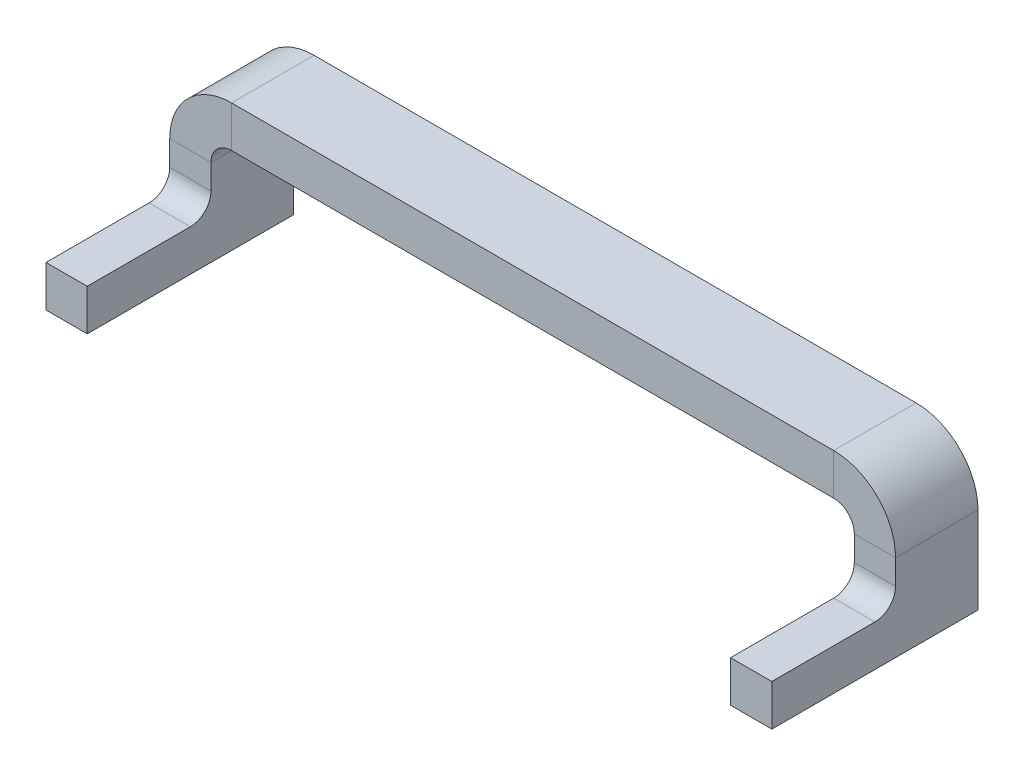
ISO-10303-21;
HEADER;
FILE_DESCRIPTION(('STEP AP214'),'2;1');
FILE_NAME('part.step','',(''),(''),'','','');
FILE_SCHEMA(('AUTOMOTIVE_DESIGN { 1 0 10303 214 1 1 1 1 }'));
ENDSEC;
DATA;
#1=APPLICATION_CONTEXT('core data for automotive mechanical design processes');
#2=APPLICATION_PROTOCOL_DEFINITION('international standard','automotive_design',2000,#1);
#3=PRODUCT_CONTEXT('',#1,'mechanical');
#4=PRODUCT('Part','Part','',(#3));
#5=PRODUCT_RELATED_PRODUCT_CATEGORY('part','',(#4));
#6=PRODUCT_DEFINITION_FORMATION('','',#4);
#7=PRODUCT_DEFINITION_CONTEXT('part definition',#1,'design');
#8=PRODUCT_DEFINITION('design','',#6,#7);
#9=PRODUCT_DEFINITION_SHAPE('','',#8);
#10=(LENGTH_UNIT() NAMED_UNIT(*) SI_UNIT(.MILLI.,.METRE.));
#11=(NAMED_UNIT(*) PLANE_ANGLE_UNIT() SI_UNIT($,.RADIAN.));
#12=(NAMED_UNIT(*) SI_UNIT($,.STERADIAN.) SOLID_ANGLE_UNIT());
#13=UNCERTAINTY_MEASURE_WITH_UNIT(LENGTH_MEASURE(1.E-05),#10,'distance_accuracy_value','');
#14=(GEOMETRIC_REPRESENTATION_CONTEXT(3) GLOBAL_UNCERTAINTY_ASSIGNED_CONTEXT((#13)) GLOBAL_UNIT_ASSIGNED_CONTEXT((#10,
#11,#12)) REPRESENTATION_CONTEXT('',''));
#15=CARTESIAN_POINT('',(0.,0.,0.));
#16=DIRECTION('',(0.,0.,1.));
#17=DIRECTION('',(1.,0.,0.));
#18=AXIS2_PLACEMENT_3D('',#15,#16,#17);
#19=CARTESIAN_POINT('',(88.0000000000001,-26.,20.));
#20=DIRECTION('',(0.,0.,1.));
#21=DIRECTION('',(0.,-1.,0.));
#22=AXIS2_PLACEMENT_3D('',#19,#20,#21);
#23=PLANE('',#22);
#24=DIRECTION('',(0.,1.,0.));
#25=VECTOR('',#24,1.);
#26=CARTESIAN_POINT('',(78.0000000000001,-26.,20.));
#27=LINE('',#26,#25);
#28=CARTESIAN_POINT('',(78.,-11.0000000000006,20.));
#29=VERTEX_POINT('',#28);
#30=CARTESIAN_POINT('',(78.,-4.99999999999998,20.));
#31=VERTEX_POINT('',#30);
#32=EDGE_CURVE('E239',#29,#31,#27,.T.);
#33=ORIENTED_EDGE('',*,*,#32,.F.);
#34=DIRECTION('',(1.,0.,0.));
#35=VECTOR('',#34,1.);
#36=CARTESIAN_POINT('',(88.0000000000001,-11.0000000000006,20.));
#37=LINE('',#36,#35);
#38=CARTESIAN_POINT('',(88.,-11.0000000000006,20.));
#39=VERTEX_POINT('',#38);
#40=EDGE_CURVE('E382',#29,#39,#37,.T.);
#41=ORIENTED_EDGE('',*,*,#40,.T.);
#42=DIRECTION('',(0.,1.,0.));
#43=VECTOR('',#42,1.);
#44=CARTESIAN_POINT('',(88.0000000000001,-26.,20.));
#45=LINE('',#44,#43);
#46=CARTESIAN_POINT('',(88.,-4.99999999999994,20.));
#47=VERTEX_POINT('',#46);
#48=EDGE_CURVE('E242',#39,#47,#45,.T.);
#49=ORIENTED_EDGE('',*,*,#48,.T.);
#50=DIRECTION('',(1.,0.,0.));
#51=VECTOR('',#50,1.);
#52=CARTESIAN_POINT('',(78.,-4.99999999999998,20.));
#53=LINE('',#52,#51);
#54=EDGE_CURVE('E224',#31,#47,#53,.T.);
#55=ORIENTED_EDGE('',*,*,#54,.F.);
#56=EDGE_LOOP('',(#33,#41,#49,#55));
#57=FACE_BOUND('',#56,.T.);
#58=ADVANCED_FACE('F43',(#57),#23,.T.);
#59=CARTESIAN_POINT('',(-88.0000000000001,-26.,20.));
#60=DIRECTION('',(0.,0.,1.));
#61=DIRECTION('',(0.,-1.,0.));
#62=AXIS2_PLACEMENT_3D('',#59,#60,#61);
#63=PLANE('',#62);
#64=DIRECTION('',(0.,-1.,0.));
#65=VECTOR('',#64,1.);
#66=CARTESIAN_POINT('',(-88.0000000000001,-26.,20.));
#67=LINE('',#66,#65);
#68=CARTESIAN_POINT('',(-88.,-4.99999999999994,20.));
#69=VERTEX_POINT('',#68);
#70=CARTESIAN_POINT('',(-88.,-11.,20.));
#71=VERTEX_POINT('',#70);
#72=EDGE_CURVE('E304',#69,#71,#67,.T.);
#73=ORIENTED_EDGE('',*,*,#72,.T.);
#74=DIRECTION('',(1.,0.,0.));
#75=VECTOR('',#74,1.);
#76=CARTESIAN_POINT('',(-88.,-11.,20.));
#77=LINE('',#76,#75);
#78=CARTESIAN_POINT('',(-78.,-11.,20.));
#79=VERTEX_POINT('',#78);
#80=EDGE_CURVE('E369',#71,#79,#77,.T.);
#81=ORIENTED_EDGE('',*,*,#80,.T.);
#82=DIRECTION('',(0.,-1.,0.));
#83=VECTOR('',#82,1.);
#84=CARTESIAN_POINT('',(-78.0000000000001,-26.,20.));
#85=LINE('',#84,#83);
#86=CARTESIAN_POINT('',(-78.,-4.99999999999998,20.));
#87=VERTEX_POINT('',#86);
#88=EDGE_CURVE('E303',#87,#79,#85,.T.);
#89=ORIENTED_EDGE('',*,*,#88,.F.);
#90=DIRECTION('',(-1.,0.,0.));
#91=VECTOR('',#90,1.);
#92=CARTESIAN_POINT('',(-78.,-4.99999999999998,20.));
#93=LINE('',#92,#91);
#94=EDGE_CURVE('E284',#87,#69,#93,.T.);
#95=ORIENTED_EDGE('',*,*,#94,.T.);
#96=EDGE_LOOP('',(#73,#81,#89,#95));
#97=FACE_BOUND('',#96,.T.);
#98=ADVANCED_FACE('F403',(#97),#63,.T.);
#99=CARTESIAN_POINT('',(-78.,10.,20.));
#100=DIRECTION('',(0.,0.,-1.));
#101=DIRECTION('',(-1.,0.,0.));
#102=AXIS2_PLACEMENT_3D('',#99,#100,#101);
#103=PLANE('',#102);
#104=DIRECTION('',(0.,1.,0.));
#105=VECTOR('',#104,1.);
#106=CARTESIAN_POINT('',(73.,0.,20.));
#107=LINE('',#106,#105);
#108=CARTESIAN_POINT('',(73.,0.,20.));
#109=VERTEX_POINT('',#108);
#110=CARTESIAN_POINT('',(73.,10.,20.));
#111=VERTEX_POINT('',#110);
#112=EDGE_CURVE('E266',#109,#111,#107,.T.);
#113=ORIENTED_EDGE('',*,*,#112,.T.);
#114=DIRECTION('',(1.,0.,0.));
#115=VECTOR('',#114,1.);
#116=CARTESIAN_POINT('',(-78.,10.,20.));
#117=LINE('',#116,#115);
#118=CARTESIAN_POINT('',(-73.,10.,20.));
#119=VERTEX_POINT('',#118);
#120=EDGE_CURVE('E360',#119,#111,#117,.T.);
#121=ORIENTED_EDGE('',*,*,#120,.F.);
#122=DIRECTION('',(0.,1.,0.));
#123=VECTOR('',#122,1.);
#124=CARTESIAN_POINT('',(-73.,0.,20.));
#125=LINE('',#124,#123);
#126=CARTESIAN_POINT('',(-73.,0.,20.));
#127=VERTEX_POINT('',#126);
#128=EDGE_CURVE('E352',#127,#119,#125,.T.);
#129=ORIENTED_EDGE('',*,*,#128,.F.);
#130=DIRECTION('',(1.,0.,0.));
#131=VECTOR('',#130,1.);
#132=CARTESIAN_POINT('',(-78.,0.,20.));
#133=LINE('',#132,#131);
#134=EDGE_CURVE('E356',#127,#109,#133,.T.);
#135=ORIENTED_EDGE('',*,*,#134,.T.);
#136=EDGE_LOOP('',(#113,#121,#129,#135));
#137=FACE_BOUND('',#136,.T.);
#138=ADVANCED_FACE('F439',(#137),#103,.F.);
#139=CARTESIAN_POINT('',(78.,10.,0.));
#140=DIRECTION('',(0.,0.,1.));
#141=DIRECTION('',(1.,0.,0.));
#142=AXIS2_PLACEMENT_3D('',#139,#140,#141);
#143=PLANE('',#142);
#144=DIRECTION('',(0.,1.,0.));
#145=VECTOR('',#144,1.);
#146=CARTESIAN_POINT('',(73.,0.,0.));
#147=LINE('',#146,#145);
#148=CARTESIAN_POINT('',(73.,0.,0.));
#149=VERTEX_POINT('',#148);
#150=CARTESIAN_POINT('',(73.,10.,0.));
#151=VERTEX_POINT('',#150);
#152=EDGE_CURVE('E280',#149,#151,#147,.T.);
#153=ORIENTED_EDGE('',*,*,#152,.F.);
#154=DIRECTION('',(-1.,0.,0.));
#155=VECTOR('',#154,1.);
#156=CARTESIAN_POINT('',(78.,0.,0.));
#157=LINE('',#156,#155);
#158=CARTESIAN_POINT('',(-73.,0.,0.));
#159=VERTEX_POINT('',#158);
#160=EDGE_CURVE('E365',#149,#159,#157,.T.);
#161=ORIENTED_EDGE('',*,*,#160,.T.);
#162=DIRECTION('',(0.,1.,0.));
#163=VECTOR('',#162,1.);
#164=CARTESIAN_POINT('',(-73.,0.,0.));
#165=LINE('',#164,#163);
#166=CARTESIAN_POINT('',(-73.,10.,0.));
#167=VERTEX_POINT('',#166);
#168=EDGE_CURVE('E338',#159,#167,#165,.T.);
#169=ORIENTED_EDGE('',*,*,#168,.T.);
#170=DIRECTION('',(-1.,0.,0.));
#171=VECTOR('',#170,1.);
#172=CARTESIAN_POINT('',(78.,10.,0.));
#173=LINE('',#172,#171);
#174=EDGE_CURVE('E364',#151,#167,#173,.T.);
#175=ORIENTED_EDGE('',*,*,#174,.F.);
#176=EDGE_LOOP('',(#153,#161,#169,#175));
#177=FACE_BOUND('',#176,.T.);
#178=ADVANCED_FACE('F456',(#177),#143,.F.);
#179=CARTESIAN_POINT('',(0.,10.,0.));
#180=DIRECTION('',(0.,1.,0.));
#181=DIRECTION('',(0.,0.,1.));
#182=AXIS2_PLACEMENT_3D('',#179,#180,#181);
#183=PLANE('',#182);
#184=ORIENTED_EDGE('',*,*,#120,.T.);
#185=DIRECTION('',(0.,0.,1.));
#186=VECTOR('',#185,1.);
#187=CARTESIAN_POINT('',(73.,10.,20.));
#188=LINE('',#187,#186);
#189=EDGE_CURVE('E257',#111,#151,#188,.F.);
#190=ORIENTED_EDGE('',*,*,#189,.T.);
#191=ORIENTED_EDGE('',*,*,#174,.T.);
#192=DIRECTION('',(0.,0.,-1.));
#193=VECTOR('',#192,1.);
#194=CARTESIAN_POINT('',(-73.,10.,0.));
#195=LINE('',#194,#193);
#196=EDGE_CURVE('E329',#167,#119,#195,.F.);
#197=ORIENTED_EDGE('',*,*,#196,.T.);
#198=EDGE_LOOP('',(#184,#190,#191,#197));
#199=FACE_BOUND('',#198,.T.);
#200=ADVANCED_FACE('F437',(#199),#183,.T.);
#201=CARTESIAN_POINT('',(0.,0.,0.));
#202=DIRECTION('',(0.,1.,0.));
#203=DIRECTION('',(0.,0.,1.));
#204=AXIS2_PLACEMENT_3D('',#201,#202,#203);
#205=PLANE('',#204);
#206=DIRECTION('',(0.,0.,1.));
#207=VECTOR('',#206,1.);
#208=CARTESIAN_POINT('',(73.,0.,20.));
#209=LINE('',#208,#207);
#210=EDGE_CURVE('E274',#109,#149,#209,.F.);
#211=ORIENTED_EDGE('',*,*,#210,.F.);
#212=ORIENTED_EDGE('',*,*,#134,.F.);
#213=DIRECTION('',(0.,0.,-1.));
#214=VECTOR('',#213,1.);
#215=CARTESIAN_POINT('',(-73.,0.,0.));
#216=LINE('',#215,#214);
#217=EDGE_CURVE('E346',#159,#127,#216,.F.);
#218=ORIENTED_EDGE('',*,*,#217,.F.);
#219=ORIENTED_EDGE('',*,*,#160,.F.);
#220=EDGE_LOOP('',(#211,#212,#218,#219));
#221=FACE_BOUND('',#220,.T.);
#222=ADVANCED_FACE('F452',(#221),#205,.F.);
#223=CARTESIAN_POINT('',(-73.,-5.,20.));
#224=DIRECTION('',(0.,0.,1.));
#225=DIRECTION('',(1.,0.,0.));
#226=AXIS2_PLACEMENT_3D('',#223,#224,#225);
#227=PLANE('',#226);
#228=ORIENTED_EDGE('',*,*,#94,.F.);
#229=CARTESIAN_POINT('',(-73.,-5.,20.));
#230=DIRECTION('',(0.,0.,-1.));
#231=DIRECTION('',(-1.,0.,0.));
#232=AXIS2_PLACEMENT_3D('',#229,#230,#231);
#233=CIRCLE('',#232,5.);
#234=EDGE_CURVE('E342',#127,#87,#233,.F.);
#235=ORIENTED_EDGE('',*,*,#234,.F.);
#236=ORIENTED_EDGE('',*,*,#128,.T.);
#237=CARTESIAN_POINT('',(-73.,-5.,20.));
#238=DIRECTION('',(0.,0.,-1.));
#239=DIRECTION('',(-1.,0.,0.));
#240=AXIS2_PLACEMENT_3D('',#237,#238,#239);
#241=CIRCLE('',#240,15.);
#242=EDGE_CURVE('E333',#119,#69,#241,.F.);
#243=ORIENTED_EDGE('',*,*,#242,.T.);
#244=EDGE_LOOP('',(#228,#235,#236,#243));
#245=FACE_BOUND('',#244,.T.);
#246=ADVANCED_FACE('F430',(#245),#227,.T.);
#247=CARTESIAN_POINT('',(-73.,-5.,0.));
#248=DIRECTION('',(0.,0.,1.));
#249=DIRECTION('',(1.,0.,0.));
#250=AXIS2_PLACEMENT_3D('',#247,#248,#249);
#251=PLANE('',#250);
#252=CARTESIAN_POINT('',(-73.,-5.,0.));
#253=DIRECTION('',(0.,0.,-1.));
#254=DIRECTION('',(-1.,0.,0.));
#255=AXIS2_PLACEMENT_3D('',#252,#253,#254);
#256=CIRCLE('',#255,5.);
#257=CARTESIAN_POINT('',(-78.,-4.99999999999998,0.));
#258=VERTEX_POINT('',#257);
#259=EDGE_CURVE('E328',#258,#159,#256,.T.);
#260=ORIENTED_EDGE('',*,*,#259,.F.);
#261=DIRECTION('',(-1.,0.,0.));
#262=VECTOR('',#261,1.);
#263=CARTESIAN_POINT('',(-78.,-4.99999999999998,0.));
#264=LINE('',#263,#262);
#265=CARTESIAN_POINT('',(-88.,-4.99999999999994,0.));
#266=VERTEX_POINT('',#265);
#267=EDGE_CURVE('E292',#258,#266,#264,.T.);
#268=ORIENTED_EDGE('',*,*,#267,.T.);
#269=CARTESIAN_POINT('',(-73.,-5.,0.));
#270=DIRECTION('',(0.,0.,-1.));
#271=DIRECTION('',(-1.,0.,0.));
#272=AXIS2_PLACEMENT_3D('',#269,#270,#271);
#273=CIRCLE('',#272,15.);
#274=EDGE_CURVE('E334',#266,#167,#273,.T.);
#275=ORIENTED_EDGE('',*,*,#274,.T.);
#276=ORIENTED_EDGE('',*,*,#168,.F.);
#277=EDGE_LOOP('',(#260,#268,#275,#276));
#278=FACE_BOUND('',#277,.T.);
#279=ADVANCED_FACE('F426',(#278),#251,.F.);
#280=CARTESIAN_POINT('',(-73.,-5.,0.));
#281=DIRECTION('',(0.,0.,-1.));
#282=DIRECTION('',(-1.,0.,0.));
#283=AXIS2_PLACEMENT_3D('',#280,#281,#282);
#284=CYLINDRICAL_SURFACE('',#283,15.);
#285=ORIENTED_EDGE('',*,*,#196,.F.);
#286=ORIENTED_EDGE('',*,*,#274,.F.);
#287=DIRECTION('',(0.,0.,-1.));
#288=VECTOR('',#287,1.);
#289=CARTESIAN_POINT('',(-88.,-4.99999999999994,0.));
#290=LINE('',#289,#288);
#291=EDGE_CURVE('E296',#69,#266,#290,.T.);
#292=ORIENTED_EDGE('',*,*,#291,.F.);
#293=ORIENTED_EDGE('',*,*,#242,.F.);
#294=EDGE_LOOP('',(#285,#286,#292,#293));
#295=FACE_BOUND('',#294,.T.);
#296=ADVANCED_FACE('F428',(#295),#284,.T.);
#297=CARTESIAN_POINT('',(-73.,-5.,0.));
#298=DIRECTION('',(0.,0.,-1.));
#299=DIRECTION('',(-1.,0.,0.));
#300=AXIS2_PLACEMENT_3D('',#297,#298,#299);
#301=CYLINDRICAL_SURFACE('',#300,5.);
#302=ORIENTED_EDGE('',*,*,#217,.T.);
#303=ORIENTED_EDGE('',*,*,#234,.T.);
#304=DIRECTION('',(0.,0.,-1.));
#305=VECTOR('',#304,1.);
#306=CARTESIAN_POINT('',(-78.,-4.99999999999998,20.));
#307=LINE('',#306,#305);
#308=EDGE_CURVE('E288',#87,#258,#307,.T.);
#309=ORIENTED_EDGE('',*,*,#308,.T.);
#310=ORIENTED_EDGE('',*,*,#259,.T.);
#311=EDGE_LOOP('',(#302,#303,#309,#310));
#312=FACE_BOUND('',#311,.T.);
#313=ADVANCED_FACE('F509',(#312),#301,.F.);
#314=CARTESIAN_POINT('',(-88.,0.,0.));
#315=DIRECTION('',(0.,0.,-1.));
#316=DIRECTION('',(-1.,0.,0.));
#317=AXIS2_PLACEMENT_3D('',#314,#315,#316);
#318=PLANE('',#317);
#319=DIRECTION('',(0.,1.,0.));
#320=VECTOR('',#319,1.);
#321=CARTESIAN_POINT('',(-88.,0.,0.));
#322=LINE('',#321,#320);
#323=CARTESIAN_POINT('',(-88.0000000000001,-26.,0.));
#324=VERTEX_POINT('',#323);
#325=EDGE_CURVE('E313',#324,#266,#322,.T.);
#326=ORIENTED_EDGE('',*,*,#325,.T.);
#327=ORIENTED_EDGE('',*,*,#267,.F.);
#328=DIRECTION('',(0.,1.,0.));
#329=VECTOR('',#328,1.);
#330=CARTESIAN_POINT('',(-78.,0.,0.));
#331=LINE('',#330,#329);
#332=CARTESIAN_POINT('',(-78.0000000000001,-26.,0.));
#333=VERTEX_POINT('',#332);
#334=EDGE_CURVE('E309',#333,#258,#331,.T.);
#335=ORIENTED_EDGE('',*,*,#334,.F.);
#336=DIRECTION('',(1.,0.,0.));
#337=VECTOR('',#336,1.);
#338=CARTESIAN_POINT('',(-88.0000000000001,-26.,0.));
#339=LINE('',#338,#337);
#340=EDGE_CURVE('E316',#324,#333,#339,.T.);
#341=ORIENTED_EDGE('',*,*,#340,.F.);
#342=EDGE_LOOP('',(#326,#327,#335,#341));
#343=FACE_BOUND('',#342,.T.);
#344=ADVANCED_FACE('F421',(#343),#318,.T.);
#345=CARTESIAN_POINT('',(-88.,3.26348357352535E-13,0.));
#346=DIRECTION('',(-1.,0.,0.));
#347=DIRECTION('',(0.,-1.,0.));
#348=AXIS2_PLACEMENT_3D('',#345,#346,#347);
#349=PLANE('',#348);
#350=DIRECTION('',(0.,0.,-1.));
#351=VECTOR('',#350,1.);
#352=CARTESIAN_POINT('',(-88.0000000000001,-26.,0.));
#353=LINE('',#352,#351);
#354=CARTESIAN_POINT('',(-88.0000000000001,-26.,50.));
#355=VERTEX_POINT('',#354);
#356=EDGE_CURVE('E308',#355,#324,#353,.T.);
#357=ORIENTED_EDGE('',*,*,#356,.F.);
#358=DIRECTION('',(0.,-1.,0.));
#359=VECTOR('',#358,1.);
#360=CARTESIAN_POINT('',(-88.0000000000001,-16.,50.));
#361=LINE('',#360,#359);
#362=CARTESIAN_POINT('',(-88.0000000000001,-16.,50.));
#363=VERTEX_POINT('',#362);
#364=EDGE_CURVE('E212',#363,#355,#361,.T.);
#365=ORIENTED_EDGE('',*,*,#364,.F.);
#366=DIRECTION('',(0.,0.,-1.));
#367=VECTOR('',#366,1.);
#368=CARTESIAN_POINT('',(-88.0000000000001,-16.,0.));
#369=LINE('',#368,#367);
#370=CARTESIAN_POINT('',(-88.0000000000001,-16.,25.));
#371=VERTEX_POINT('',#370);
#372=EDGE_CURVE('E204',#363,#371,#369,.T.);
#373=ORIENTED_EDGE('',*,*,#372,.T.);
#374=CARTESIAN_POINT('',(-88.,-11.,25.));
#375=DIRECTION('',(-1.,0.,0.));
#376=DIRECTION('',(0.,-1.,0.));
#377=AXIS2_PLACEMENT_3D('',#374,#375,#376);
#378=CIRCLE('',#377,5.);
#379=EDGE_CURVE('E391',#371,#71,#378,.F.);
#380=ORIENTED_EDGE('',*,*,#379,.T.);
#381=ORIENTED_EDGE('',*,*,#72,.F.);
#382=ORIENTED_EDGE('',*,*,#291,.T.);
#383=ORIENTED_EDGE('',*,*,#325,.F.);
#384=EDGE_LOOP('',(#357,#365,#373,#380,#381,#382,#383));
#385=FACE_BOUND('',#384,.T.);
#386=ADVANCED_FACE('F397',(#385),#349,.T.);
#387=CARTESIAN_POINT('',(-78.,2.91433543964103E-13,0.));
#388=DIRECTION('',(-1.,0.,0.));
#389=DIRECTION('',(0.,-1.,0.));
#390=AXIS2_PLACEMENT_3D('',#387,#388,#389);
#391=PLANE('',#390);
#392=ORIENTED_EDGE('',*,*,#334,.T.);
#393=ORIENTED_EDGE('',*,*,#308,.F.);
#394=ORIENTED_EDGE('',*,*,#88,.T.);
#395=CARTESIAN_POINT('',(-78.,-11.,25.));
#396=DIRECTION('',(-1.,0.,0.));
#397=DIRECTION('',(0.,-1.,0.));
#398=AXIS2_PLACEMENT_3D('',#395,#396,#397);
#399=CIRCLE('',#398,5.);
#400=CARTESIAN_POINT('',(-78.,-16.,25.));
#401=VERTEX_POINT('',#400);
#402=EDGE_CURVE('E388',#79,#401,#399,.T.);
#403=ORIENTED_EDGE('',*,*,#402,.T.);
#404=DIRECTION('',(0.,0.,1.));
#405=VECTOR('',#404,1.);
#406=CARTESIAN_POINT('',(-78.,-16.,0.));
#407=LINE('',#406,#405);
#408=CARTESIAN_POINT('',(-78.0000000000001,-16.,50.));
#409=VERTEX_POINT('',#408);
#410=EDGE_CURVE('E197',#401,#409,#407,.T.);
#411=ORIENTED_EDGE('',*,*,#410,.T.);
#412=DIRECTION('',(0.,-1.,0.));
#413=VECTOR('',#412,1.);
#414=CARTESIAN_POINT('',(-78.0000000000001,-16.,50.));
#415=LINE('',#414,#413);
#416=CARTESIAN_POINT('',(-78.0000000000001,-26.,50.));
#417=VERTEX_POINT('',#416);
#418=EDGE_CURVE('E208',#409,#417,#415,.T.);
#419=ORIENTED_EDGE('',*,*,#418,.T.);
#420=DIRECTION('',(0.,0.,-1.));
#421=VECTOR('',#420,1.);
#422=CARTESIAN_POINT('',(-78.0000000000001,-26.,0.));
#423=LINE('',#422,#421);
#424=EDGE_CURVE('E320',#417,#333,#423,.T.);
#425=ORIENTED_EDGE('',*,*,#424,.T.);
#426=EDGE_LOOP('',(#392,#393,#394,#403,#411,#419,#425));
#427=FACE_BOUND('',#426,.T.);
#428=ADVANCED_FACE('F408',(#427),#391,.F.);
#429=CARTESIAN_POINT('',(-88.0000000000001,-26.,0.));
#430=DIRECTION('',(0.,-1.,0.));
#431=DIRECTION('',(1.,0.,0.));
#432=AXIS2_PLACEMENT_3D('',#429,#430,#431);
#433=PLANE('',#432);
#434=ORIENTED_EDGE('',*,*,#424,.F.);
#435=DIRECTION('',(-1.,0.,0.));
#436=VECTOR('',#435,1.);
#437=CARTESIAN_POINT('',(-78.0000000000001,-26.,50.));
#438=LINE('',#437,#436);
#439=EDGE_CURVE('E195',#417,#355,#438,.T.);
#440=ORIENTED_EDGE('',*,*,#439,.T.);
#441=ORIENTED_EDGE('',*,*,#356,.T.);
#442=ORIENTED_EDGE('',*,*,#340,.T.);
#443=EDGE_LOOP('',(#434,#440,#441,#442));
#444=FACE_BOUND('',#443,.T.);
#445=ADVANCED_FACE('F500',(#444),#433,.T.);
#446=CARTESIAN_POINT('',(73.,-5.,0.));
#447=DIRECTION('',(0.,0.,-1.));
#448=DIRECTION('',(-1.,0.,0.));
#449=AXIS2_PLACEMENT_3D('',#446,#447,#448);
#450=PLANE('',#449);
#451=DIRECTION('',(1.,0.,0.));
#452=VECTOR('',#451,1.);
#453=CARTESIAN_POINT('',(78.,-4.99999999999998,0.));
#454=LINE('',#453,#452);
#455=CARTESIAN_POINT('',(78.,-4.99999999999998,0.));
#456=VERTEX_POINT('',#455);
#457=CARTESIAN_POINT('',(88.,-4.99999999999994,0.));
#458=VERTEX_POINT('',#457);
#459=EDGE_CURVE('E216',#456,#458,#454,.T.);
#460=ORIENTED_EDGE('',*,*,#459,.F.);
#461=CARTESIAN_POINT('',(73.,-5.,0.));
#462=DIRECTION('',(0.,0.,1.));
#463=DIRECTION('',(1.,0.,0.));
#464=AXIS2_PLACEMENT_3D('',#461,#462,#463);
#465=CIRCLE('',#464,5.);
#466=EDGE_CURVE('E270',#149,#456,#465,.F.);
#467=ORIENTED_EDGE('',*,*,#466,.F.);
#468=ORIENTED_EDGE('',*,*,#152,.T.);
#469=CARTESIAN_POINT('',(73.,-5.,0.));
#470=DIRECTION('',(0.,0.,1.));
#471=DIRECTION('',(1.,0.,0.));
#472=AXIS2_PLACEMENT_3D('',#469,#470,#471);
#473=CIRCLE('',#472,15.);
#474=EDGE_CURVE('E261',#151,#458,#473,.F.);
#475=ORIENTED_EDGE('',*,*,#474,.T.);
#476=EDGE_LOOP('',(#460,#467,#468,#475));
#477=FACE_BOUND('',#476,.T.);
#478=ADVANCED_FACE('F458',(#477),#450,.T.);
#479=CARTESIAN_POINT('',(73.,-5.,20.));
#480=DIRECTION('',(0.,0.,-1.));
#481=DIRECTION('',(-1.,0.,0.));
#482=AXIS2_PLACEMENT_3D('',#479,#480,#481);
#483=PLANE('',#482);
#484=CARTESIAN_POINT('',(73.,-5.,20.));
#485=DIRECTION('',(0.,0.,1.));
#486=DIRECTION('',(1.,0.,0.));
#487=AXIS2_PLACEMENT_3D('',#484,#485,#486);
#488=CIRCLE('',#487,5.);
#489=EDGE_CURVE('E256',#31,#109,#488,.T.);
#490=ORIENTED_EDGE('',*,*,#489,.F.);
#491=ORIENTED_EDGE('',*,*,#54,.T.);
#492=CARTESIAN_POINT('',(73.,-5.,20.));
#493=DIRECTION('',(0.,0.,1.));
#494=DIRECTION('',(1.,0.,0.));
#495=AXIS2_PLACEMENT_3D('',#492,#493,#494);
#496=CIRCLE('',#495,15.);
#497=EDGE_CURVE('E262',#47,#111,#496,.T.);
#498=ORIENTED_EDGE('',*,*,#497,.T.);
#499=ORIENTED_EDGE('',*,*,#112,.F.);
#500=EDGE_LOOP('',(#490,#491,#498,#499));
#501=FACE_BOUND('',#500,.T.);
#502=ADVANCED_FACE('F442',(#501),#483,.F.);
#503=CARTESIAN_POINT('',(73.,-5.,20.));
#504=DIRECTION('',(0.,0.,1.));
#505=DIRECTION('',(1.,0.,0.));
#506=AXIS2_PLACEMENT_3D('',#503,#504,#505);
#507=CYLINDRICAL_SURFACE('',#506,15.);
#508=ORIENTED_EDGE('',*,*,#189,.F.);
#509=ORIENTED_EDGE('',*,*,#497,.F.);
#510=DIRECTION('',(0.,0.,-1.));
#511=VECTOR('',#510,1.);
#512=CARTESIAN_POINT('',(88.,-4.99999999999994,0.));
#513=LINE('',#512,#511);
#514=EDGE_CURVE('E228',#47,#458,#513,.T.);
#515=ORIENTED_EDGE('',*,*,#514,.T.);
#516=ORIENTED_EDGE('',*,*,#474,.F.);
#517=EDGE_LOOP('',(#508,#509,#515,#516));
#518=FACE_BOUND('',#517,.T.);
#519=ADVANCED_FACE('F460',(#518),#507,.T.);
#520=CARTESIAN_POINT('',(73.,-5.,20.));
#521=DIRECTION('',(0.,0.,1.));
#522=DIRECTION('',(1.,0.,0.));
#523=AXIS2_PLACEMENT_3D('',#520,#521,#522);
#524=CYLINDRICAL_SURFACE('',#523,5.);
#525=ORIENTED_EDGE('',*,*,#210,.T.);
#526=ORIENTED_EDGE('',*,*,#466,.T.);
#527=DIRECTION('',(0.,0.,1.));
#528=VECTOR('',#527,1.);
#529=CARTESIAN_POINT('',(78.,-4.99999999999998,0.));
#530=LINE('',#529,#528);
#531=EDGE_CURVE('E220',#456,#31,#530,.T.);
#532=ORIENTED_EDGE('',*,*,#531,.T.);
#533=ORIENTED_EDGE('',*,*,#489,.T.);
#534=EDGE_LOOP('',(#525,#526,#532,#533));
#535=FACE_BOUND('',#534,.T.);
#536=ADVANCED_FACE('F447',(#535),#524,.F.);
#537=CARTESIAN_POINT('',(88.,0.,0.));
#538=DIRECTION('',(0.,0.,-1.));
#539=DIRECTION('',(-1.,0.,0.));
#540=AXIS2_PLACEMENT_3D('',#537,#538,#539);
#541=PLANE('',#540);
#542=DIRECTION('',(-1.,0.,0.));
#543=VECTOR('',#542,1.);
#544=CARTESIAN_POINT('',(88.0000000000001,-26.,0.));
#545=LINE('',#544,#543);
#546=CARTESIAN_POINT('',(88.0000000000001,-26.,0.));
#547=VERTEX_POINT('',#546);
#548=CARTESIAN_POINT('',(78.0000000000001,-26.,0.));
#549=VERTEX_POINT('',#548);
#550=EDGE_CURVE('E245',#547,#549,#545,.T.);
#551=ORIENTED_EDGE('',*,*,#550,.T.);
#552=DIRECTION('',(0.,-1.,0.));
#553=VECTOR('',#552,1.);
#554=CARTESIAN_POINT('',(78.,0.,0.));
#555=LINE('',#554,#553);
#556=EDGE_CURVE('E234',#456,#549,#555,.T.);
#557=ORIENTED_EDGE('',*,*,#556,.F.);
#558=ORIENTED_EDGE('',*,*,#459,.T.);
#559=DIRECTION('',(0.,-1.,0.));
#560=VECTOR('',#559,1.);
#561=CARTESIAN_POINT('',(88.,0.,0.));
#562=LINE('',#561,#560);
#563=EDGE_CURVE('E235',#458,#547,#562,.T.);
#564=ORIENTED_EDGE('',*,*,#563,.T.);
#565=EDGE_LOOP('',(#551,#557,#558,#564));
#566=FACE_BOUND('',#565,.T.);
#567=ADVANCED_FACE('F465',(#566),#541,.T.);
#568=CARTESIAN_POINT('',(88.,3.26348357352535E-13,0.));
#569=DIRECTION('',(-1.,0.,0.));
#570=DIRECTION('',(0.,-1.,0.));
#571=AXIS2_PLACEMENT_3D('',#568,#569,#570);
#572=PLANE('',#571);
#573=DIRECTION('',(0.,0.,1.));
#574=VECTOR('',#573,1.);
#575=CARTESIAN_POINT('',(88.0000000000001,-26.,0.));
#576=LINE('',#575,#574);
#577=CARTESIAN_POINT('',(88.0000000000001,-26.0000000000006,50.));
#578=VERTEX_POINT('',#577);
#579=EDGE_CURVE('E238',#547,#578,#576,.T.);
#580=ORIENTED_EDGE('',*,*,#579,.F.);
#581=ORIENTED_EDGE('',*,*,#563,.F.);
#582=ORIENTED_EDGE('',*,*,#514,.F.);
#583=ORIENTED_EDGE('',*,*,#48,.F.);
#584=CARTESIAN_POINT('',(88.,-11.0000000000006,25.));
#585=DIRECTION('',(-1.,0.,0.));
#586=DIRECTION('',(0.,-1.,0.));
#587=AXIS2_PLACEMENT_3D('',#584,#585,#586);
#588=CIRCLE('',#587,5.);
#589=CARTESIAN_POINT('',(88.0000000000001,-16.0000000000006,25.));
#590=VERTEX_POINT('',#589);
#591=EDGE_CURVE('E52',#39,#590,#588,.T.);
#592=ORIENTED_EDGE('',*,*,#591,.T.);
#593=DIRECTION('',(0.,0.,1.));
#594=VECTOR('',#593,1.);
#595=CARTESIAN_POINT('',(88.0000000000001,-16.0000000000006,0.));
#596=LINE('',#595,#594);
#597=CARTESIAN_POINT('',(88.0000000000001,-16.0000000000006,50.));
#598=VERTEX_POINT('',#597);
#599=EDGE_CURVE('E166',#590,#598,#596,.T.);
#600=ORIENTED_EDGE('',*,*,#599,.T.);
#601=DIRECTION('',(0.,-1.,0.));
#602=VECTOR('',#601,1.);
#603=CARTESIAN_POINT('',(88.0000000000001,-16.0000000000006,50.));
#604=LINE('',#603,#602);
#605=EDGE_CURVE('E170',#598,#578,#604,.T.);
#606=ORIENTED_EDGE('',*,*,#605,.T.);
#607=EDGE_LOOP('',(#580,#581,#582,#583,#592,#600,#606));
#608=FACE_BOUND('',#607,.T.);
#609=ADVANCED_FACE('F169',(#608),#572,.F.);
#610=CARTESIAN_POINT('',(78.,2.91433543964103E-13,0.));
#611=DIRECTION('',(-1.,0.,0.));
#612=DIRECTION('',(0.,-1.,0.));
#613=AXIS2_PLACEMENT_3D('',#610,#611,#612);
#614=PLANE('',#613);
#615=DIRECTION('',(0.,0.,1.));
#616=VECTOR('',#615,1.);
#617=CARTESIAN_POINT('',(78.0000000000001,-26.,0.));
#618=LINE('',#617,#616);
#619=CARTESIAN_POINT('',(78.0000000000001,-26.0000000000006,50.));
#620=VERTEX_POINT('',#619);
#621=EDGE_CURVE('E248',#549,#620,#618,.T.);
#622=ORIENTED_EDGE('',*,*,#621,.T.);
#623=DIRECTION('',(0.,-1.,0.));
#624=VECTOR('',#623,1.);
#625=CARTESIAN_POINT('',(78.0000000000001,-16.0000000000006,50.));
#626=LINE('',#625,#624);
#627=CARTESIAN_POINT('',(78.0000000000001,-16.0000000000006,50.));
#628=VERTEX_POINT('',#627);
#629=EDGE_CURVE('E183',#628,#620,#626,.T.);
#630=ORIENTED_EDGE('',*,*,#629,.F.);
#631=DIRECTION('',(0.,0.,-1.));
#632=VECTOR('',#631,1.);
#633=CARTESIAN_POINT('',(78.0000000000001,-16.0000000000006,0.));
#634=LINE('',#633,#632);
#635=CARTESIAN_POINT('',(78.0000000000001,-16.0000000000006,25.));
#636=VERTEX_POINT('',#635);
#637=EDGE_CURVE('E184',#628,#636,#634,.T.);
#638=ORIENTED_EDGE('',*,*,#637,.T.);
#639=CARTESIAN_POINT('',(78.,-11.0000000000006,25.));
#640=DIRECTION('',(-1.,0.,0.));
#641=DIRECTION('',(0.,-1.,0.));
#642=AXIS2_PLACEMENT_3D('',#639,#640,#641);
#643=CIRCLE('',#642,5.);
#644=EDGE_CURVE('E11',#636,#29,#643,.F.);
#645=ORIENTED_EDGE('',*,*,#644,.T.);
#646=ORIENTED_EDGE('',*,*,#32,.T.);
#647=ORIENTED_EDGE('',*,*,#531,.F.);
#648=ORIENTED_EDGE('',*,*,#556,.T.);
#649=EDGE_LOOP('',(#622,#630,#638,#645,#646,#647,#648));
#650=FACE_BOUND('',#649,.T.);
#651=ADVANCED_FACE('F471',(#650),#614,.T.);
#652=CARTESIAN_POINT('',(88.0000000000001,-26.,0.));
#653=DIRECTION('',(0.,-1.,0.));
#654=DIRECTION('',(1.,0.,0.));
#655=AXIS2_PLACEMENT_3D('',#652,#653,#654);
#656=PLANE('',#655);
#657=ORIENTED_EDGE('',*,*,#621,.F.);
#658=ORIENTED_EDGE('',*,*,#550,.F.);
#659=ORIENTED_EDGE('',*,*,#579,.T.);
#660=DIRECTION('',(-1.,0.,0.));
#661=VECTOR('',#660,1.);
#662=CARTESIAN_POINT('',(88.0000000000001,-26.0000000000006,50.));
#663=LINE('',#662,#661);
#664=EDGE_CURVE('E175',#578,#620,#663,.T.);
#665=ORIENTED_EDGE('',*,*,#664,.T.);
#666=EDGE_LOOP('',(#657,#658,#659,#665));
#667=FACE_BOUND('',#666,.T.);
#668=ADVANCED_FACE('F469',(#667),#656,.T.);
#669=CARTESIAN_POINT('',(-78.0000000000001,-16.,50.));
#670=DIRECTION('',(0.,0.,1.));
#671=DIRECTION('',(1.,0.,0.));
#672=AXIS2_PLACEMENT_3D('',#669,#670,#671);
#673=PLANE('',#672);
#674=ORIENTED_EDGE('',*,*,#439,.F.);
#675=ORIENTED_EDGE('',*,*,#418,.F.);
#676=DIRECTION('',(-1.,0.,0.));
#677=VECTOR('',#676,1.);
#678=CARTESIAN_POINT('',(-78.0000000000001,-16.,50.));
#679=LINE('',#678,#677);
#680=EDGE_CURVE('E200',#409,#363,#679,.T.);
#681=ORIENTED_EDGE('',*,*,#680,.T.);
#682=ORIENTED_EDGE('',*,*,#364,.T.);
#683=EDGE_LOOP('',(#674,#675,#681,#682));
#684=FACE_BOUND('',#683,.T.);
#685=ADVANCED_FACE('F416',(#684),#673,.T.);
#686=CARTESIAN_POINT('',(0.,-16.0000000000003,0.));
#687=DIRECTION('',(0.,-1.,0.));
#688=DIRECTION('',(1.,0.,0.));
#689=AXIS2_PLACEMENT_3D('',#686,#687,#688);
#690=PLANE('',#689);
#691=ORIENTED_EDGE('',*,*,#410,.F.);
#692=DIRECTION('',(1.,0.,0.));
#693=VECTOR('',#692,1.);
#694=CARTESIAN_POINT('',(0.,-16.0000000000003,25.));
#695=LINE('',#694,#693);
#696=EDGE_CURVE('E379',#401,#371,#695,.F.);
#697=ORIENTED_EDGE('',*,*,#696,.T.);
#698=ORIENTED_EDGE('',*,*,#372,.F.);
#699=ORIENTED_EDGE('',*,*,#680,.F.);
#700=EDGE_LOOP('',(#691,#697,#698,#699));
#701=FACE_BOUND('',#700,.T.);
#702=ADVANCED_FACE('F413',(#701),#690,.F.);
#703=CARTESIAN_POINT('',(88.0000000000001,-16.0000000000006,50.));
#704=DIRECTION('',(0.,0.,1.));
#705=DIRECTION('',(1.,0.,0.));
#706=AXIS2_PLACEMENT_3D('',#703,#704,#705);
#707=PLANE('',#706);
#708=ORIENTED_EDGE('',*,*,#664,.F.);
#709=ORIENTED_EDGE('',*,*,#605,.F.);
#710=DIRECTION('',(-1.,0.,0.));
#711=VECTOR('',#710,1.);
#712=CARTESIAN_POINT('',(88.0000000000001,-16.0000000000006,50.));
#713=LINE('',#712,#711);
#714=EDGE_CURVE('E174',#598,#628,#713,.T.);
#715=ORIENTED_EDGE('',*,*,#714,.T.);
#716=ORIENTED_EDGE('',*,*,#629,.T.);
#717=EDGE_LOOP('',(#708,#709,#715,#716));
#718=FACE_BOUND('',#717,.T.);
#719=ADVANCED_FACE('F179',(#718),#707,.T.);
#720=CARTESIAN_POINT('',(0.,-16.0000000000003,0.));
#721=DIRECTION('',(0.,-1.,0.));
#722=DIRECTION('',(1.,0.,0.));
#723=AXIS2_PLACEMENT_3D('',#720,#721,#722);
#724=PLANE('',#723);
#725=ORIENTED_EDGE('',*,*,#599,.F.);
#726=DIRECTION('',(1.,0.,0.));
#727=VECTOR('',#726,1.);
#728=CARTESIAN_POINT('',(0.,-16.0000000000003,25.));
#729=LINE('',#728,#727);
#730=EDGE_CURVE('E65',#590,#636,#729,.F.);
#731=ORIENTED_EDGE('',*,*,#730,.T.);
#732=ORIENTED_EDGE('',*,*,#637,.F.);
#733=ORIENTED_EDGE('',*,*,#714,.F.);
#734=EDGE_LOOP('',(#725,#731,#732,#733));
#735=FACE_BOUND('',#734,.T.);
#736=ADVANCED_FACE('F186',(#735),#724,.F.);
#737=CARTESIAN_POINT('',(-88.,-11.,25.));
#738=DIRECTION('',(1.,0.,0.));
#739=DIRECTION('',(0.,1.,0.));
#740=AXIS2_PLACEMENT_3D('',#737,#738,#739);
#741=CYLINDRICAL_SURFACE('',#740,5.);
#742=ORIENTED_EDGE('',*,*,#379,.F.);
#743=ORIENTED_EDGE('',*,*,#696,.F.);
#744=ORIENTED_EDGE('',*,*,#402,.F.);
#745=ORIENTED_EDGE('',*,*,#80,.F.);
#746=EDGE_LOOP('',(#742,#743,#744,#745));
#747=FACE_BOUND('',#746,.T.);
#748=ADVANCED_FACE('F405',(#747),#741,.F.);
#749=CARTESIAN_POINT('',(88.0000000000001,-11.0000000000006,25.));
#750=DIRECTION('',(1.,0.,0.));
#751=DIRECTION('',(0.,1.,0.));
#752=AXIS2_PLACEMENT_3D('',#749,#750,#751);
#753=CYLINDRICAL_SURFACE('',#752,5.);
#754=ORIENTED_EDGE('',*,*,#644,.F.);
#755=ORIENTED_EDGE('',*,*,#730,.F.);
#756=ORIENTED_EDGE('',*,*,#591,.F.);
#757=ORIENTED_EDGE('',*,*,#40,.F.);
#758=EDGE_LOOP('',(#754,#755,#756,#757));
#759=FACE_BOUND('',#758,.T.);
#760=ADVANCED_FACE('F45',(#759),#753,.F.);
#761=CLOSED_SHELL('',(#58,#98,#138,#178,#200,#222,#246,#279,#296,#313,#344,#386,#428,#445,#478,
#502,#519,#536,#567,#609,#651,#668,#685,#702,#719,#736,#748,#760));
#762=MANIFOLD_SOLID_BREP('B2',#761);
#763=ADVANCED_BREP_SHAPE_REPRESENTATION('',(#18,#762),#14);
#764=SHAPE_DEFINITION_REPRESENTATION(#9,#763);
ENDSEC;
END-ISO-10303-21;
